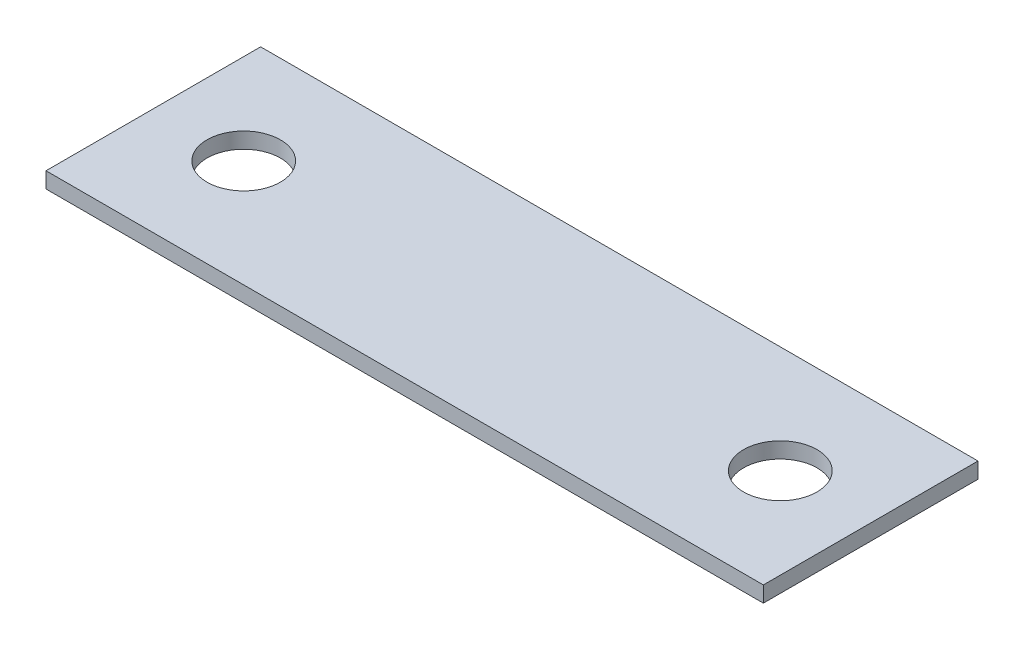
ISO-10303-21;
HEADER;
FILE_DESCRIPTION(('STEP AP214'),'2;1');
FILE_NAME('part.step','',(''),(''),'','','');
FILE_SCHEMA(('AUTOMOTIVE_DESIGN { 1 0 10303 214 1 1 1 1 }'));
ENDSEC;
DATA;
#1=APPLICATION_CONTEXT('core data for automotive mechanical design processes');
#2=APPLICATION_PROTOCOL_DEFINITION('international standard','automotive_design',2000,#1);
#3=PRODUCT_CONTEXT('',#1,'mechanical');
#4=PRODUCT('Part','Part','',(#3));
#5=PRODUCT_RELATED_PRODUCT_CATEGORY('part','',(#4));
#6=PRODUCT_DEFINITION_FORMATION('','',#4);
#7=PRODUCT_DEFINITION_CONTEXT('part definition',#1,'design');
#8=PRODUCT_DEFINITION('design','',#6,#7);
#9=PRODUCT_DEFINITION_SHAPE('','',#8);
#10=(LENGTH_UNIT() NAMED_UNIT(*) SI_UNIT(.MILLI.,.METRE.));
#11=(NAMED_UNIT(*) PLANE_ANGLE_UNIT() SI_UNIT($,.RADIAN.));
#12=(NAMED_UNIT(*) SI_UNIT($,.STERADIAN.) SOLID_ANGLE_UNIT());
#13=UNCERTAINTY_MEASURE_WITH_UNIT(LENGTH_MEASURE(1.E-05),#10,'distance_accuracy_value','');
#14=(GEOMETRIC_REPRESENTATION_CONTEXT(3) GLOBAL_UNCERTAINTY_ASSIGNED_CONTEXT((#13)) GLOBAL_UNIT_ASSIGNED_CONTEXT((#10,
#11,#12)) REPRESENTATION_CONTEXT('',''));
#15=CARTESIAN_POINT('',(0.,0.,0.));
#16=DIRECTION('',(0.,0.,1.));
#17=DIRECTION('',(1.,0.,0.));
#18=AXIS2_PLACEMENT_3D('',#15,#16,#17);
#19=CARTESIAN_POINT('',(0.,2.8,0.));
#20=DIRECTION('',(0.,1.,0.));
#21=DIRECTION('',(0.,0.,1.));
#22=AXIS2_PLACEMENT_3D('',#19,#20,#21);
#23=PLANE('',#22);
#24=CARTESIAN_POINT('',(-47.5,2.8,0.));
#25=DIRECTION('',(0.,1.,0.));
#26=DIRECTION('',(0.,0.,1.));
#27=AXIS2_PLACEMENT_3D('',#24,#25,#26);
#28=CIRCLE('',#27,6.5);
#29=CARTESIAN_POINT('',(-47.5,2.8,6.5));
#30=VERTEX_POINT('',#29);
#31=EDGE_CURVE('E112',#30,#30,#28,.T.);
#32=ORIENTED_EDGE('',*,*,#31,.F.);
#33=EDGE_LOOP('',(#32));
#34=FACE_BOUND('',#33,.T.);
#35=DIRECTION('',(0.,0.,-1.));
#36=VECTOR('',#35,1.);
#37=CARTESIAN_POINT('',(63.5,2.8,-19.));
#38=LINE('',#37,#36);
#39=CARTESIAN_POINT('',(63.5,2.8,19.));
#40=VERTEX_POINT('',#39);
#41=CARTESIAN_POINT('',(63.5,2.8,-19.));
#42=VERTEX_POINT('',#41);
#43=EDGE_CURVE('E92',#40,#42,#38,.T.);
#44=ORIENTED_EDGE('',*,*,#43,.T.);
#45=DIRECTION('',(-1.,0.,0.));
#46=VECTOR('',#45,1.);
#47=CARTESIAN_POINT('',(-63.5,2.8,-19.));
#48=LINE('',#47,#46);
#49=CARTESIAN_POINT('',(-63.5,2.8,-19.));
#50=VERTEX_POINT('',#49);
#51=EDGE_CURVE('E87',#42,#50,#48,.T.);
#52=ORIENTED_EDGE('',*,*,#51,.T.);
#53=DIRECTION('',(0.,0.,1.));
#54=VECTOR('',#53,1.);
#55=CARTESIAN_POINT('',(-63.5,2.8,-19.));
#56=LINE('',#55,#54);
#57=CARTESIAN_POINT('',(-63.5,2.8,19.));
#58=VERTEX_POINT('',#57);
#59=EDGE_CURVE('E90',#50,#58,#56,.T.);
#60=ORIENTED_EDGE('',*,*,#59,.T.);
#61=DIRECTION('',(1.,0.,0.));
#62=VECTOR('',#61,1.);
#63=CARTESIAN_POINT('',(-63.5,2.8,19.));
#64=LINE('',#63,#62);
#65=EDGE_CURVE('E57',#58,#40,#64,.T.);
#66=ORIENTED_EDGE('',*,*,#65,.T.);
#67=EDGE_LOOP('',(#44,#52,#60,#66));
#68=FACE_BOUND('',#67,.T.);
#69=CARTESIAN_POINT('',(47.5,2.8,0.));
#70=DIRECTION('',(0.,1.,0.));
#71=DIRECTION('',(0.,0.,-1.));
#72=AXIS2_PLACEMENT_3D('',#69,#70,#71);
#73=CIRCLE('',#72,6.5);
#74=CARTESIAN_POINT('',(47.5,2.8,-6.50000000000003));
#75=VERTEX_POINT('',#74);
#76=EDGE_CURVE('E134',#75,#75,#73,.T.);
#77=ORIENTED_EDGE('',*,*,#76,.F.);
#78=EDGE_LOOP('',(#77));
#79=FACE_BOUND('',#78,.T.);
#80=ADVANCED_FACE('F39',(#34,#68,#79),#23,.T.);
#81=CARTESIAN_POINT('',(0.,0.,0.));
#82=DIRECTION('',(0.,1.,0.));
#83=DIRECTION('',(0.,0.,1.));
#84=AXIS2_PLACEMENT_3D('',#81,#82,#83);
#85=PLANE('',#84);
#86=DIRECTION('',(0.,0.,-1.));
#87=VECTOR('',#86,1.);
#88=CARTESIAN_POINT('',(63.5,0.,-19.));
#89=LINE('',#88,#87);
#90=CARTESIAN_POINT('',(63.5,0.,19.));
#91=VERTEX_POINT('',#90);
#92=CARTESIAN_POINT('',(63.5,0.,-19.));
#93=VERTEX_POINT('',#92);
#94=EDGE_CURVE('E108',#91,#93,#89,.T.);
#95=ORIENTED_EDGE('',*,*,#94,.F.);
#96=DIRECTION('',(1.,0.,0.));
#97=VECTOR('',#96,1.);
#98=CARTESIAN_POINT('',(-63.5,0.,19.));
#99=LINE('',#98,#97);
#100=CARTESIAN_POINT('',(-63.5,0.,19.));
#101=VERTEX_POINT('',#100);
#102=EDGE_CURVE('E80',#101,#91,#99,.T.);
#103=ORIENTED_EDGE('',*,*,#102,.F.);
#104=DIRECTION('',(0.,0.,1.));
#105=VECTOR('',#104,1.);
#106=CARTESIAN_POINT('',(-63.5,0.,-19.));
#107=LINE('',#106,#105);
#108=CARTESIAN_POINT('',(-63.5,0.,-19.));
#109=VERTEX_POINT('',#108);
#110=EDGE_CURVE('E74',#109,#101,#107,.T.);
#111=ORIENTED_EDGE('',*,*,#110,.F.);
#112=DIRECTION('',(-1.,0.,0.));
#113=VECTOR('',#112,1.);
#114=CARTESIAN_POINT('',(-63.5,0.,-19.));
#115=LINE('',#114,#113);
#116=EDGE_CURVE('E97',#93,#109,#115,.T.);
#117=ORIENTED_EDGE('',*,*,#116,.F.);
#118=EDGE_LOOP('',(#95,#103,#111,#117));
#119=FACE_BOUND('',#118,.T.);
#120=CARTESIAN_POINT('',(-47.5,0.,0.));
#121=DIRECTION('',(0.,1.,0.));
#122=DIRECTION('',(0.,0.,1.));
#123=AXIS2_PLACEMENT_3D('',#120,#121,#122);
#124=CIRCLE('',#123,6.5);
#125=CARTESIAN_POINT('',(-47.5,0.,6.5));
#126=VERTEX_POINT('',#125);
#127=EDGE_CURVE('E130',#126,#126,#124,.T.);
#128=ORIENTED_EDGE('',*,*,#127,.T.);
#129=EDGE_LOOP('',(#128));
#130=FACE_BOUND('',#129,.T.);
#131=CARTESIAN_POINT('',(47.5,0.,0.));
#132=DIRECTION('',(0.,1.,0.));
#133=DIRECTION('',(0.,0.,-1.));
#134=AXIS2_PLACEMENT_3D('',#131,#132,#133);
#135=CIRCLE('',#134,6.5);
#136=CARTESIAN_POINT('',(47.5,0.,-6.50000000000003));
#137=VERTEX_POINT('',#136);
#138=EDGE_CURVE('E138',#137,#137,#135,.T.);
#139=ORIENTED_EDGE('',*,*,#138,.T.);
#140=EDGE_LOOP('',(#139));
#141=FACE_BOUND('',#140,.T.);
#142=ADVANCED_FACE('F125',(#119,#130,#141),#85,.F.);
#143=CARTESIAN_POINT('',(63.5,2.8,-19.));
#144=DIRECTION('',(-1.,0.,0.));
#145=DIRECTION('',(0.,0.,1.));
#146=AXIS2_PLACEMENT_3D('',#143,#144,#145);
#147=PLANE('',#146);
#148=ORIENTED_EDGE('',*,*,#94,.T.);
#149=DIRECTION('',(0.,-1.,0.));
#150=VECTOR('',#149,1.);
#151=CARTESIAN_POINT('',(63.5,2.8,-19.));
#152=LINE('',#151,#150);
#153=EDGE_CURVE('E11',#42,#93,#152,.T.);
#154=ORIENTED_EDGE('',*,*,#153,.F.);
#155=ORIENTED_EDGE('',*,*,#43,.F.);
#156=DIRECTION('',(0.,-1.,0.));
#157=VECTOR('',#156,1.);
#158=CARTESIAN_POINT('',(63.5,2.8,19.));
#159=LINE('',#158,#157);
#160=EDGE_CURVE('E104',#40,#91,#159,.T.);
#161=ORIENTED_EDGE('',*,*,#160,.T.);
#162=EDGE_LOOP('',(#148,#154,#155,#161));
#163=FACE_BOUND('',#162,.T.);
#164=ADVANCED_FACE('F41',(#163),#147,.F.);
#165=CARTESIAN_POINT('',(-63.5,2.8,-19.));
#166=DIRECTION('',(0.,0.,1.));
#167=DIRECTION('',(1.,0.,0.));
#168=AXIS2_PLACEMENT_3D('',#165,#166,#167);
#169=PLANE('',#168);
#170=ORIENTED_EDGE('',*,*,#116,.T.);
#171=DIRECTION('',(0.,-1.,0.));
#172=VECTOR('',#171,1.);
#173=CARTESIAN_POINT('',(-63.5,2.8,-19.));
#174=LINE('',#173,#172);
#175=EDGE_CURVE('E49',#50,#109,#174,.T.);
#176=ORIENTED_EDGE('',*,*,#175,.F.);
#177=ORIENTED_EDGE('',*,*,#51,.F.);
#178=ORIENTED_EDGE('',*,*,#153,.T.);
#179=EDGE_LOOP('',(#170,#176,#177,#178));
#180=FACE_BOUND('',#179,.T.);
#181=ADVANCED_FACE('F96',(#180),#169,.F.);
#182=CARTESIAN_POINT('',(-63.5,2.8,-19.));
#183=DIRECTION('',(1.,0.,0.));
#184=DIRECTION('',(0.,0.,-1.));
#185=AXIS2_PLACEMENT_3D('',#182,#183,#184);
#186=PLANE('',#185);
#187=ORIENTED_EDGE('',*,*,#110,.T.);
#188=DIRECTION('',(0.,-1.,0.));
#189=VECTOR('',#188,1.);
#190=CARTESIAN_POINT('',(-63.5,2.8,19.));
#191=LINE('',#190,#189);
#192=EDGE_CURVE('E99',#58,#101,#191,.T.);
#193=ORIENTED_EDGE('',*,*,#192,.F.);
#194=ORIENTED_EDGE('',*,*,#59,.F.);
#195=ORIENTED_EDGE('',*,*,#175,.T.);
#196=EDGE_LOOP('',(#187,#193,#194,#195));
#197=FACE_BOUND('',#196,.T.);
#198=ADVANCED_FACE('F100',(#197),#186,.F.);
#199=CARTESIAN_POINT('',(-63.5,2.8,19.));
#200=DIRECTION('',(0.,0.,-1.));
#201=DIRECTION('',(-1.,0.,0.));
#202=AXIS2_PLACEMENT_3D('',#199,#200,#201);
#203=PLANE('',#202);
#204=ORIENTED_EDGE('',*,*,#102,.T.);
#205=ORIENTED_EDGE('',*,*,#160,.F.);
#206=ORIENTED_EDGE('',*,*,#65,.F.);
#207=ORIENTED_EDGE('',*,*,#192,.T.);
#208=EDGE_LOOP('',(#204,#205,#206,#207));
#209=FACE_BOUND('',#208,.T.);
#210=ADVANCED_FACE('F122',(#209),#203,.F.);
#211=CARTESIAN_POINT('',(-47.5,2.8,0.));
#212=DIRECTION('',(0.,-1.,0.));
#213=DIRECTION('',(0.,0.,-1.));
#214=AXIS2_PLACEMENT_3D('',#211,#212,#213);
#215=CYLINDRICAL_SURFACE('',#214,6.5);
#216=ORIENTED_EDGE('',*,*,#31,.T.);
#217=EDGE_LOOP('',(#216));
#218=FACE_BOUND('',#217,.T.);
#219=ORIENTED_EDGE('',*,*,#127,.F.);
#220=EDGE_LOOP('',(#219));
#221=FACE_BOUND('',#220,.T.);
#222=ADVANCED_FACE('F157',(#218,#221),#215,.F.);
#223=CARTESIAN_POINT('',(47.5,2.8,0.));
#224=DIRECTION('',(0.,-1.,0.));
#225=DIRECTION('',(0.,0.,-1.));
#226=AXIS2_PLACEMENT_3D('',#223,#224,#225);
#227=CYLINDRICAL_SURFACE('',#226,6.5);
#228=ORIENTED_EDGE('',*,*,#76,.T.);
#229=EDGE_LOOP('',(#228));
#230=FACE_BOUND('',#229,.T.);
#231=ORIENTED_EDGE('',*,*,#138,.F.);
#232=EDGE_LOOP('',(#231));
#233=FACE_BOUND('',#232,.T.);
#234=ADVANCED_FACE('F146',(#230,#233),#227,.F.);
#235=CLOSED_SHELL('',(#80,#142,#164,#181,#198,#210,#222,#234));
#236=MANIFOLD_SOLID_BREP('B2',#235);
#237=ADVANCED_BREP_SHAPE_REPRESENTATION('',(#18,#236),#14);
#238=SHAPE_DEFINITION_REPRESENTATION(#9,#237);
ENDSEC;
END-ISO-10303-21;
